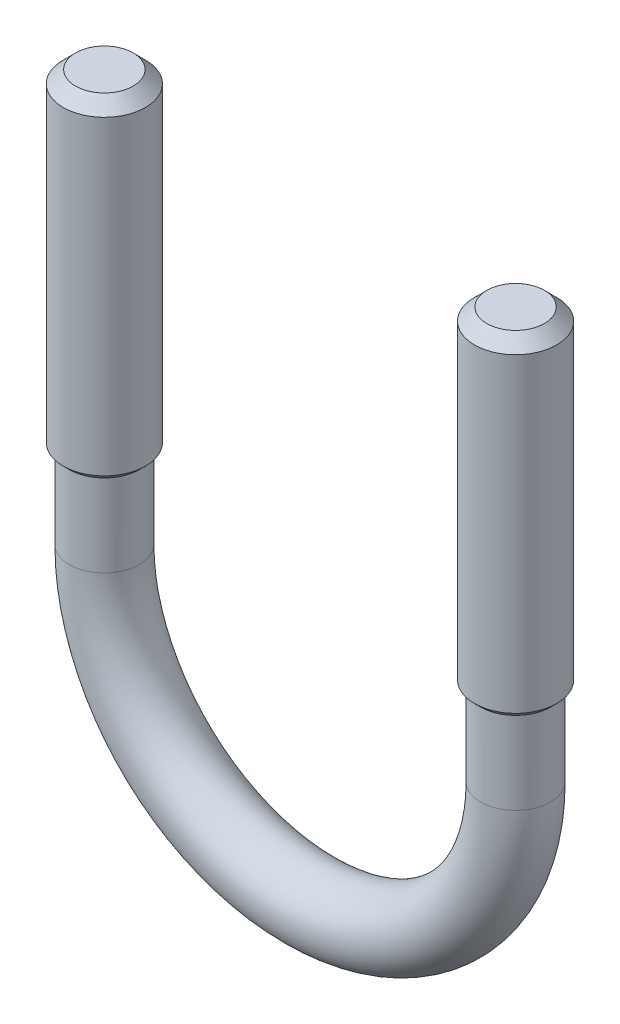
ISO-10303-21;
HEADER;
FILE_DESCRIPTION(('STEP AP214'),'2;1');
FILE_NAME('part.step','',(''),(''),'','','');
FILE_SCHEMA(('AUTOMOTIVE_DESIGN { 1 0 10303 214 1 1 1 1 }'));
ENDSEC;
DATA;
#1=APPLICATION_CONTEXT('core data for automotive mechanical design processes');
#2=APPLICATION_PROTOCOL_DEFINITION('international standard','automotive_design',2000,#1);
#3=PRODUCT_CONTEXT('',#1,'mechanical');
#4=PRODUCT('Part','Part','',(#3));
#5=PRODUCT_RELATED_PRODUCT_CATEGORY('part','',(#4));
#6=PRODUCT_DEFINITION_FORMATION('','',#4);
#7=PRODUCT_DEFINITION_CONTEXT('part definition',#1,'design');
#8=PRODUCT_DEFINITION('design','',#6,#7);
#9=PRODUCT_DEFINITION_SHAPE('','',#8);
#10=(LENGTH_UNIT() NAMED_UNIT(*) SI_UNIT(.MILLI.,.METRE.));
#11=(NAMED_UNIT(*) PLANE_ANGLE_UNIT() SI_UNIT($,.RADIAN.));
#12=(NAMED_UNIT(*) SI_UNIT($,.STERADIAN.) SOLID_ANGLE_UNIT());
#13=UNCERTAINTY_MEASURE_WITH_UNIT(LENGTH_MEASURE(1.E-05),#10,'distance_accuracy_value','');
#14=(GEOMETRIC_REPRESENTATION_CONTEXT(3) GLOBAL_UNCERTAINTY_ASSIGNED_CONTEXT((#13)) GLOBAL_UNIT_ASSIGNED_CONTEXT((#10,
#11,#12)) REPRESENTATION_CONTEXT('',''));
#15=CARTESIAN_POINT('',(0.,0.,0.));
#16=DIRECTION('',(0.,0.,1.));
#17=DIRECTION('',(1.,0.,0.));
#18=AXIS2_PLACEMENT_3D('',#15,#16,#17);
#19=CARTESIAN_POINT('',(-15.875,6.34999999999999,0.));
#20=DIRECTION('',(0.,1.,0.));
#21=DIRECTION('',(0.,0.,1.));
#22=AXIS2_PLACEMENT_3D('',#19,#20,#21);
#23=CYLINDRICAL_SURFACE('',#22,3.17500000000001);
#24=CARTESIAN_POINT('',(-15.875,6.8199,0.));
#25=DIRECTION('',(0.,1.,0.));
#26=DIRECTION('',(0.,0.,1.));
#27=AXIS2_PLACEMENT_3D('',#24,#25,#26);
#28=CIRCLE('',#27,3.17500000000001);
#29=CARTESIAN_POINT('',(-15.875,6.81989999999999,3.175));
#30=VERTEX_POINT('',#29);
#31=EDGE_CURVE('E54',#30,#30,#28,.T.);
#32=ORIENTED_EDGE('',*,*,#31,.T.);
#33=EDGE_LOOP('',(#32));
#34=FACE_BOUND('',#33,.T.);
#35=CARTESIAN_POINT('',(-15.875,30.7975,0.));
#36=DIRECTION('',(0.,1.,0.));
#37=DIRECTION('',(0.,0.,1.));
#38=AXIS2_PLACEMENT_3D('',#35,#36,#37);
#39=CIRCLE('',#38,3.17500000000001);
#40=CARTESIAN_POINT('',(-15.875,30.7975,3.17500000000001));
#41=VERTEX_POINT('',#40);
#42=EDGE_CURVE('E59',#41,#41,#39,.F.);
#43=ORIENTED_EDGE('',*,*,#42,.T.);
#44=EDGE_LOOP('',(#43));
#45=FACE_BOUND('',#44,.T.);
#46=ADVANCED_FACE('F46',(#34,#45),#23,.T.);
#47=CARTESIAN_POINT('',(-15.875,31.75,0.));
#48=DIRECTION('',(0.,1.,0.));
#49=DIRECTION('',(0.,0.,1.));
#50=AXIS2_PLACEMENT_3D('',#47,#48,#49);
#51=PLANE('',#50);
#52=CARTESIAN_POINT('',(-15.875,31.75,0.));
#53=DIRECTION('',(0.,1.,0.));
#54=DIRECTION('',(0.,0.,1.));
#55=AXIS2_PLACEMENT_3D('',#52,#53,#54);
#56=CIRCLE('',#55,2.22250000000001);
#57=CARTESIAN_POINT('',(-15.875,31.75,2.22250000000001));
#58=VERTEX_POINT('',#57);
#59=EDGE_CURVE('E64',#58,#58,#56,.T.);
#60=ORIENTED_EDGE('',*,*,#59,.T.);
#61=EDGE_LOOP('',(#60));
#62=FACE_BOUND('',#61,.T.);
#63=ADVANCED_FACE('F113',(#62),#51,.T.);
#64=CARTESIAN_POINT('',(-15.875,31.75,0.));
#65=DIRECTION('',(0.,-1.,0.));
#66=DIRECTION('',(0.,0.,-1.));
#67=AXIS2_PLACEMENT_3D('',#64,#65,#66);
#68=CONICAL_SURFACE('',#67,2.22250000000001,0.785398163397449);
#69=ORIENTED_EDGE('',*,*,#42,.F.);
#70=EDGE_LOOP('',(#69));
#71=FACE_BOUND('',#70,.T.);
#72=ORIENTED_EDGE('',*,*,#59,.F.);
#73=EDGE_LOOP('',(#72));
#74=FACE_BOUND('',#73,.T.);
#75=ADVANCED_FACE('F120',(#71,#74),#68,.T.);
#76=CARTESIAN_POINT('',(-15.875,6.8199,0.));
#77=DIRECTION('',(0.,1.,0.));
#78=DIRECTION('',(0.,0.,1.));
#79=AXIS2_PLACEMENT_3D('',#76,#77,#78);
#80=CONICAL_SURFACE('',#79,3.17500000000001,0.785398163397451);
#81=CARTESIAN_POINT('',(-15.875,6.34999999999999,0.));
#82=DIRECTION('',(0.,1.,0.));
#83=DIRECTION('',(0.,0.,1.));
#84=AXIS2_PLACEMENT_3D('',#81,#82,#83);
#85=CIRCLE('',#84,2.7051);
#86=CARTESIAN_POINT('',(-15.875,6.34999999999999,2.7051));
#87=VERTEX_POINT('',#86);
#88=EDGE_CURVE('E11',#87,#87,#85,.F.);
#89=CARTESIAN_POINT('',(-15.875,6.34999999999999,2.7051));
#90=CARTESIAN_POINT('',(-15.875,6.35489479166666,2.70999479166667));
#91=CARTESIAN_POINT('',(-15.875,6.35978958333333,2.71488958333333));
#92=CARTESIAN_POINT('',(-15.875,6.36957916666666,2.72467916666667));
#93=CARTESIAN_POINT('',(-15.875,6.37447395833333,2.72957395833333));
#94=CARTESIAN_POINT('',(-15.875,6.38426354166666,2.73936354166667));
#95=CARTESIAN_POINT('',(-15.875,6.38915833333333,2.74425833333333));
#96=CARTESIAN_POINT('',(-15.875,6.39894791666666,2.75404791666667));
#97=CARTESIAN_POINT('',(-15.875,6.40384270833333,2.75894270833333));
#98=CARTESIAN_POINT('',(-15.875,6.41363229166666,2.76873229166667));
#99=CARTESIAN_POINT('',(-15.875,6.41852708333333,2.77362708333334));
#100=CARTESIAN_POINT('',(-15.875,6.42831666666666,2.78341666666667));
#101=CARTESIAN_POINT('',(-15.875,6.43321145833333,2.78831145833334));
#102=CARTESIAN_POINT('',(-15.875,6.44300104166666,2.79810104166667));
#103=CARTESIAN_POINT('',(-15.875,6.44789583333333,2.80299583333334));
#104=CARTESIAN_POINT('',(-15.875,6.45768541666666,2.81278541666667));
#105=CARTESIAN_POINT('',(-15.875,6.46258020833333,2.81768020833334));
#106=CARTESIAN_POINT('',(-15.875,6.47236979166666,2.82746979166667));
#107=CARTESIAN_POINT('',(-15.875,6.47726458333333,2.83236458333334));
#108=CARTESIAN_POINT('',(-15.875,6.48705416666666,2.84215416666667));
#109=CARTESIAN_POINT('',(-15.875,6.49194895833333,2.84704895833334));
#110=CARTESIAN_POINT('',(-15.875,6.50173854166666,2.85683854166667));
#111=CARTESIAN_POINT('',(-15.875,6.50663333333333,2.86173333333334));
#112=CARTESIAN_POINT('',(-15.875,6.51642291666666,2.87152291666667));
#113=CARTESIAN_POINT('',(-15.875,6.52131770833333,2.87641770833334));
#114=CARTESIAN_POINT('',(-15.875,6.53110729166666,2.88620729166667));
#115=CARTESIAN_POINT('',(-15.875,6.53600208333333,2.89110208333334));
#116=CARTESIAN_POINT('',(-15.875,6.54579166666666,2.90089166666667));
#117=CARTESIAN_POINT('',(-15.875,6.55068645833333,2.90578645833334));
#118=CARTESIAN_POINT('',(-15.875,6.56047604166666,2.91557604166667));
#119=CARTESIAN_POINT('',(-15.875,6.56537083333333,2.92047083333334));
#120=CARTESIAN_POINT('',(-15.875,6.57516041666666,2.93026041666667));
#121=CARTESIAN_POINT('',(-15.875,6.58005520833333,2.93515520833334));
#122=CARTESIAN_POINT('',(-15.875,6.58984479166666,2.94494479166667));
#123=CARTESIAN_POINT('',(-15.875,6.59473958333333,2.94983958333334));
#124=CARTESIAN_POINT('',(-15.875,6.60452916666666,2.95962916666667));
#125=CARTESIAN_POINT('',(-15.875,6.60942395833333,2.96452395833334));
#126=CARTESIAN_POINT('',(-15.875,6.61921354166666,2.97431354166667));
#127=CARTESIAN_POINT('',(-15.875,6.62410833333333,2.97920833333334));
#128=CARTESIAN_POINT('',(-15.875,6.63389791666666,2.98899791666667));
#129=CARTESIAN_POINT('',(-15.875,6.63879270833333,2.99389270833334));
#130=CARTESIAN_POINT('',(-15.875,6.64858229166666,3.00368229166667));
#131=CARTESIAN_POINT('',(-15.875,6.65347708333333,3.00857708333334));
#132=CARTESIAN_POINT('',(-15.875,6.66326666666666,3.01836666666667));
#133=CARTESIAN_POINT('',(-15.875,6.66816145833333,3.02326145833334));
#134=CARTESIAN_POINT('',(-15.875,6.67795104166666,3.03305104166667));
#135=CARTESIAN_POINT('',(-15.875,6.68284583333333,3.03794583333334));
#136=CARTESIAN_POINT('',(-15.875,6.69263541666666,3.04773541666667));
#137=CARTESIAN_POINT('',(-15.875,6.69753020833333,3.05263020833334));
#138=CARTESIAN_POINT('',(-15.875,6.70731979166666,3.06241979166667));
#139=CARTESIAN_POINT('',(-15.875,6.71221458333333,3.06731458333334));
#140=CARTESIAN_POINT('',(-15.875,6.72200416666666,3.07710416666667));
#141=CARTESIAN_POINT('',(-15.875,6.72689895833333,3.08199895833334));
#142=CARTESIAN_POINT('',(-15.875,6.73668854166666,3.09178854166667));
#143=CARTESIAN_POINT('',(-15.875,6.74158333333333,3.09668333333334));
#144=CARTESIAN_POINT('',(-15.875,6.75137291666666,3.10647291666667));
#145=CARTESIAN_POINT('',(-15.875,6.75626770833333,3.11136770833334));
#146=CARTESIAN_POINT('',(-15.875,6.76605729166666,3.12115729166667));
#147=CARTESIAN_POINT('',(-15.875,6.77095208333333,3.12605208333334));
#148=CARTESIAN_POINT('',(-15.875,6.78074166666666,3.13584166666667));
#149=CARTESIAN_POINT('',(-15.875,6.78563645833333,3.14073645833334));
#150=CARTESIAN_POINT('',(-15.875,6.79542604166666,3.15052604166667));
#151=CARTESIAN_POINT('',(-15.875,6.80032083333333,3.15542083333334));
#152=CARTESIAN_POINT('',(-15.875,6.81011041666666,3.16521041666667));
#153=CARTESIAN_POINT('',(-15.875,6.81500520833333,3.17010520833334));
#154=CARTESIAN_POINT('',(-15.875,6.8199,3.175));
#155=B_SPLINE_CURVE_WITH_KNOTS('',3,(#89,#90,#91,#92,#93,#94,#95,#96,#97,#98,#99,#100,#101,#102,
#103,#104,#105,#106,#107,#108,#109,#110,#111,#112,#113,#114,#115,#116,#117,#118,#119,#120,#121,
#122,#123,#124,#125,#126,#127,#128,#129,#130,#131,#132,#133,#134,#135,#136,#137,#138,#139,#140,
#141,#142,#143,#144,#145,#146,#147,#148,#149,#150,#151,#152,#153,#154),.UNSPECIFIED.,.F.,.F.,(4,
2,2,2,2,2,2,2,2,2,2,2,2,2,2,2,2,2,2,2,2,2,2,2,2,2,2,2,2,2,2,2,4),(0.,0.0207668422799728,
0.0415336845599453,0.0623005268399176,0.0830673691198901,0.103834211399863,0.124601053679835,
0.145367895959808,0.16613473823978,0.186901580519753,0.207668422799725,0.228435265079698,
0.249202107359671,0.269968949639643,0.290735791919615,0.311502634199587,0.33226947647956,
0.353036318759533,0.373803161039505,0.394570003319478,0.41533684559945,0.436103687879423,
0.456870530159395,0.477637372439368,0.49840421471934,0.519171056999313,0.539937899279285,
0.560704741559258,0.58147158383923,0.602238426119203,0.623005268399175,0.643772110679147,
0.664538952959121),.UNSPECIFIED.);
#156=EDGE_CURVE('BSEAM48',#87,#30,#155,.T.);
#157=ORIENTED_EDGE('',*,*,#88,.F.);
#158=ORIENTED_EDGE('',*,*,#31,.F.);
#159=ORIENTED_EDGE('',*,*,#156,.T.);
#160=ORIENTED_EDGE('',*,*,#156,.F.);
#161=EDGE_LOOP('',(#157,#159,#158,#160));
#162=FACE_BOUND('',#161,.T.);
#163=ADVANCED_FACE('F48',(#162),#80,.T.);
#164=CARTESIAN_POINT('',(15.875,19.05,0.));
#165=DIRECTION('',(0.,-1.,0.));
#166=DIRECTION('',(1.,0.,0.));
#167=AXIS2_PLACEMENT_3D('',#164,#165,#166);
#168=CYLINDRICAL_SURFACE('',#167,2.7051);
#169=CARTESIAN_POINT('',(15.875,6.34999999999999,0.));
#170=DIRECTION('',(0.,-1.,0.));
#171=DIRECTION('',(0.,0.,1.));
#172=AXIS2_PLACEMENT_3D('',#169,#170,#171);
#173=CIRCLE('',#172,2.7051);
#174=CARTESIAN_POINT('',(15.875,6.35,2.7051));
#175=VERTEX_POINT('',#174);
#176=EDGE_CURVE('E78',#175,#175,#173,.F.);
#177=ORIENTED_EDGE('',*,*,#176,.F.);
#178=EDGE_LOOP('',(#177));
#179=FACE_BOUND('',#178,.T.);
#180=CARTESIAN_POINT('',(15.875,0.,0.));
#181=DIRECTION('',(0.,1.,0.));
#182=DIRECTION('',(0.,0.,-1.));
#183=AXIS2_PLACEMENT_3D('',#180,#181,#182);
#184=CIRCLE('',#183,2.7051);
#185=CARTESIAN_POINT('',(18.5801,0.,0.));
#186=VERTEX_POINT('',#185);
#187=EDGE_CURVE('E74',#186,#186,#184,.T.);
#188=ORIENTED_EDGE('',*,*,#187,.T.);
#189=EDGE_LOOP('',(#188));
#190=FACE_BOUND('',#189,.T.);
#191=ADVANCED_FACE('F111',(#179,#190),#168,.T.);
#192=CARTESIAN_POINT('',(0.,0.,0.));
#193=DIRECTION('',(0.,0.,-1.));
#194=DIRECTION('',(-1.,0.,0.));
#195=AXIS2_PLACEMENT_3D('',#192,#193,#194);
#196=TOROIDAL_SURFACE('',#195,15.875,2.7051);
#197=CARTESIAN_POINT('',(-15.875,0.,0.));
#198=DIRECTION('',(0.,-1.,0.));
#199=DIRECTION('',(0.,0.,-1.));
#200=AXIS2_PLACEMENT_3D('',#197,#198,#199);
#201=CIRCLE('',#200,2.7051);
#202=CARTESIAN_POINT('',(-18.5801,0.,0.));
#203=VERTEX_POINT('',#202);
#204=EDGE_CURVE('E70',#203,#203,#201,.T.);
#205=CARTESIAN_POINT('',(0.,0.,0.));
#206=DIRECTION('',(0.,0.,-1.));
#207=DIRECTION('',(-1.,0.,0.));
#208=AXIS2_PLACEMENT_3D('',#205,#206,#207);
#209=CIRCLE('',#208,18.5801);
#210=EDGE_CURVE('',#186,#203,#209,.T.);
#211=ORIENTED_EDGE('',*,*,#187,.F.);
#212=ORIENTED_EDGE('',*,*,#204,.T.);
#213=ORIENTED_EDGE('',*,*,#210,.T.);
#214=ORIENTED_EDGE('',*,*,#210,.F.);
#215=EDGE_LOOP('',(#211,#213,#212,#214));
#216=FACE_BOUND('',#215,.T.);
#217=ADVANCED_FACE('F135',(#216),#196,.T.);
#218=CARTESIAN_POINT('',(-15.875,0.,0.));
#219=DIRECTION('',(0.,1.,0.));
#220=DIRECTION('',(-1.,0.,0.));
#221=AXIS2_PLACEMENT_3D('',#218,#219,#220);
#222=CYLINDRICAL_SURFACE('',#221,2.7051);
#223=ORIENTED_EDGE('',*,*,#88,.T.);
#224=EDGE_LOOP('',(#223));
#225=FACE_BOUND('',#224,.T.);
#226=ORIENTED_EDGE('',*,*,#204,.F.);
#227=EDGE_LOOP('',(#226));
#228=FACE_BOUND('',#227,.T.);
#229=ADVANCED_FACE('F108',(#225,#228),#222,.T.);
#230=CARTESIAN_POINT('',(15.875,6.34999999999999,0.));
#231=DIRECTION('',(0.,1.,0.));
#232=DIRECTION('',(0.,0.,1.));
#233=AXIS2_PLACEMENT_3D('',#230,#231,#232);
#234=CYLINDRICAL_SURFACE('',#233,3.17500000000001);
#235=CARTESIAN_POINT('',(15.875,6.8199,0.));
#236=DIRECTION('',(0.,-1.,0.));
#237=DIRECTION('',(0.,0.,1.));
#238=AXIS2_PLACEMENT_3D('',#235,#236,#237);
#239=CIRCLE('',#238,3.17500000000001);
#240=CARTESIAN_POINT('',(15.875,6.8199,3.17500000000001));
#241=VERTEX_POINT('',#240);
#242=EDGE_CURVE('E82',#241,#241,#239,.T.);
#243=ORIENTED_EDGE('',*,*,#242,.F.);
#244=EDGE_LOOP('',(#243));
#245=FACE_BOUND('',#244,.T.);
#246=CARTESIAN_POINT('',(15.875,30.7975,0.));
#247=DIRECTION('',(0.,-1.,0.));
#248=DIRECTION('',(0.,0.,1.));
#249=AXIS2_PLACEMENT_3D('',#246,#247,#248);
#250=CIRCLE('',#249,3.17500000000001);
#251=CARTESIAN_POINT('',(15.875,30.7975,3.17500000000001));
#252=VERTEX_POINT('',#251);
#253=EDGE_CURVE('E86',#252,#252,#250,.F.);
#254=ORIENTED_EDGE('',*,*,#253,.F.);
#255=EDGE_LOOP('',(#254));
#256=FACE_BOUND('',#255,.T.);
#257=ADVANCED_FACE('F99',(#245,#256),#234,.T.);
#258=CARTESIAN_POINT('',(15.875,31.75,0.));
#259=DIRECTION('',(0.,1.,0.));
#260=DIRECTION('',(0.,0.,1.));
#261=AXIS2_PLACEMENT_3D('',#258,#259,#260);
#262=PLANE('',#261);
#263=CARTESIAN_POINT('',(15.875,31.75,0.));
#264=DIRECTION('',(0.,-1.,0.));
#265=DIRECTION('',(0.,0.,1.));
#266=AXIS2_PLACEMENT_3D('',#263,#264,#265);
#267=CIRCLE('',#266,2.22250000000001);
#268=CARTESIAN_POINT('',(15.875,31.75,2.22250000000001));
#269=VERTEX_POINT('',#268);
#270=EDGE_CURVE('E90',#269,#269,#267,.T.);
#271=ORIENTED_EDGE('',*,*,#270,.F.);
#272=EDGE_LOOP('',(#271));
#273=FACE_BOUND('',#272,.T.);
#274=ADVANCED_FACE('F97',(#273),#262,.T.);
#275=CARTESIAN_POINT('',(15.875,31.75,0.));
#276=DIRECTION('',(0.,-1.,0.));
#277=DIRECTION('',(0.,0.,-1.));
#278=AXIS2_PLACEMENT_3D('',#275,#276,#277);
#279=CONICAL_SURFACE('',#278,2.22250000000001,0.785398163397449);
#280=ORIENTED_EDGE('',*,*,#253,.T.);
#281=EDGE_LOOP('',(#280));
#282=FACE_BOUND('',#281,.T.);
#283=ORIENTED_EDGE('',*,*,#270,.T.);
#284=EDGE_LOOP('',(#283));
#285=FACE_BOUND('',#284,.T.);
#286=ADVANCED_FACE('F95',(#282,#285),#279,.T.);
#287=CARTESIAN_POINT('',(15.875,6.8199,0.));
#288=DIRECTION('',(0.,1.,0.));
#289=DIRECTION('',(0.,0.,1.));
#290=AXIS2_PLACEMENT_3D('',#287,#288,#289);
#291=CONICAL_SURFACE('',#290,3.17500000000001,0.785398163397451);
#292=CARTESIAN_POINT('',(15.875,6.35,2.7051));
#293=CARTESIAN_POINT('',(15.875,6.35489479166666,2.70999479166667));
#294=CARTESIAN_POINT('',(15.875,6.35978958333333,2.71488958333334));
#295=CARTESIAN_POINT('',(15.875,6.36957916666666,2.72467916666667));
#296=CARTESIAN_POINT('',(15.875,6.37447395833333,2.72957395833334));
#297=CARTESIAN_POINT('',(15.875,6.38426354166666,2.73936354166667));
#298=CARTESIAN_POINT('',(15.875,6.38915833333333,2.74425833333334));
#299=CARTESIAN_POINT('',(15.875,6.39894791666666,2.75404791666667));
#300=CARTESIAN_POINT('',(15.875,6.40384270833333,2.75894270833334));
#301=CARTESIAN_POINT('',(15.875,6.41363229166666,2.76873229166667));
#302=CARTESIAN_POINT('',(15.875,6.41852708333333,2.77362708333334));
#303=CARTESIAN_POINT('',(15.875,6.42831666666666,2.78341666666667));
#304=CARTESIAN_POINT('',(15.875,6.43321145833333,2.78831145833334));
#305=CARTESIAN_POINT('',(15.875,6.44300104166666,2.79810104166667));
#306=CARTESIAN_POINT('',(15.875,6.44789583333333,2.80299583333334));
#307=CARTESIAN_POINT('',(15.875,6.45768541666666,2.81278541666667));
#308=CARTESIAN_POINT('',(15.875,6.46258020833333,2.81768020833334));
#309=CARTESIAN_POINT('',(15.875,6.47236979166666,2.82746979166667));
#310=CARTESIAN_POINT('',(15.875,6.47726458333333,2.83236458333334));
#311=CARTESIAN_POINT('',(15.875,6.48705416666666,2.84215416666667));
#312=CARTESIAN_POINT('',(15.875,6.49194895833333,2.84704895833334));
#313=CARTESIAN_POINT('',(15.875,6.50173854166666,2.85683854166667));
#314=CARTESIAN_POINT('',(15.875,6.50663333333333,2.86173333333334));
#315=CARTESIAN_POINT('',(15.875,6.51642291666666,2.87152291666667));
#316=CARTESIAN_POINT('',(15.875,6.52131770833333,2.87641770833334));
#317=CARTESIAN_POINT('',(15.875,6.53110729166666,2.88620729166667));
#318=CARTESIAN_POINT('',(15.875,6.53600208333333,2.89110208333334));
#319=CARTESIAN_POINT('',(15.875,6.54579166666666,2.90089166666667));
#320=CARTESIAN_POINT('',(15.875,6.55068645833333,2.90578645833334));
#321=CARTESIAN_POINT('',(15.875,6.56047604166666,2.91557604166667));
#322=CARTESIAN_POINT('',(15.875,6.56537083333333,2.92047083333334));
#323=CARTESIAN_POINT('',(15.875,6.57516041666666,2.93026041666667));
#324=CARTESIAN_POINT('',(15.875,6.58005520833333,2.93515520833334));
#325=CARTESIAN_POINT('',(15.875,6.58984479166666,2.94494479166667));
#326=CARTESIAN_POINT('',(15.875,6.59473958333333,2.94983958333334));
#327=CARTESIAN_POINT('',(15.875,6.60452916666666,2.95962916666667));
#328=CARTESIAN_POINT('',(15.875,6.60942395833333,2.96452395833334));
#329=CARTESIAN_POINT('',(15.875,6.61921354166666,2.97431354166667));
#330=CARTESIAN_POINT('',(15.875,6.62410833333333,2.97920833333334));
#331=CARTESIAN_POINT('',(15.875,6.63389791666666,2.98899791666667));
#332=CARTESIAN_POINT('',(15.875,6.63879270833333,2.99389270833334));
#333=CARTESIAN_POINT('',(15.875,6.64858229166666,3.00368229166667));
#334=CARTESIAN_POINT('',(15.875,6.65347708333333,3.00857708333334));
#335=CARTESIAN_POINT('',(15.875,6.66326666666666,3.01836666666667));
#336=CARTESIAN_POINT('',(15.875,6.66816145833333,3.02326145833334));
#337=CARTESIAN_POINT('',(15.875,6.67795104166666,3.03305104166667));
#338=CARTESIAN_POINT('',(15.875,6.68284583333333,3.03794583333334));
#339=CARTESIAN_POINT('',(15.875,6.69263541666666,3.04773541666667));
#340=CARTESIAN_POINT('',(15.875,6.69753020833333,3.05263020833334));
#341=CARTESIAN_POINT('',(15.875,6.70731979166666,3.06241979166667));
#342=CARTESIAN_POINT('',(15.875,6.71221458333333,3.06731458333334));
#343=CARTESIAN_POINT('',(15.875,6.72200416666666,3.07710416666667));
#344=CARTESIAN_POINT('',(15.875,6.72689895833333,3.08199895833334));
#345=CARTESIAN_POINT('',(15.875,6.73668854166666,3.09178854166667));
#346=CARTESIAN_POINT('',(15.875,6.74158333333333,3.09668333333334));
#347=CARTESIAN_POINT('',(15.875,6.75137291666666,3.10647291666667));
#348=CARTESIAN_POINT('',(15.875,6.75626770833333,3.11136770833334));
#349=CARTESIAN_POINT('',(15.875,6.76605729166666,3.12115729166667));
#350=CARTESIAN_POINT('',(15.875,6.77095208333333,3.12605208333334));
#351=CARTESIAN_POINT('',(15.875,6.78074166666666,3.13584166666667));
#352=CARTESIAN_POINT('',(15.875,6.78563645833333,3.14073645833334));
#353=CARTESIAN_POINT('',(15.875,6.79542604166666,3.15052604166667));
#354=CARTESIAN_POINT('',(15.875,6.80032083333333,3.15542083333334));
#355=CARTESIAN_POINT('',(15.875,6.81011041666666,3.16521041666667));
#356=CARTESIAN_POINT('',(15.875,6.81500520833333,3.17010520833334));
#357=CARTESIAN_POINT('',(15.875,6.8199,3.17500000000001));
#358=B_SPLINE_CURVE_WITH_KNOTS('',3,(#292,#293,#294,#295,#296,#297,#298,#299,#300,#301,#302,
#303,#304,#305,#306,#307,#308,#309,#310,#311,#312,#313,#314,#315,#316,#317,#318,#319,#320,#321,
#322,#323,#324,#325,#326,#327,#328,#329,#330,#331,#332,#333,#334,#335,#336,#337,#338,#339,#340,
#341,#342,#343,#344,#345,#346,#347,#348,#349,#350,#351,#352,#353,#354,#355,#356,#357),
.UNSPECIFIED.,.F.,.F.,(4,2,2,2,2,2,2,2,2,2,2,2,2,2,2,2,2,2,2,2,2,2,2,2,2,2,2,2,2,2,2,2,4),(0.,
0.0207668422799725,0.0415336845599447,0.0623005268399172,0.0830673691198894,0.103834211399862,
0.124601053679835,0.145367895959807,0.16613473823978,0.186901580519752,0.207668422799725,
0.228435265079697,0.24920210735967,0.269968949639642,0.290735791919615,0.311502634199587,
0.33226947647956,0.353036318759532,0.373803161039505,0.394570003319477,0.415336845599449,
0.436103687879422,0.456870530159395,0.477637372439367,0.498404214719339,0.519171056999312,
0.539937899279284,0.560704741559257,0.58147158383923,0.602238426119202,0.623005268399175,
0.643772110679147,0.664538952959119),.UNSPECIFIED.);
#359=EDGE_CURVE('BSEAM105',#175,#241,#358,.T.);
#360=ORIENTED_EDGE('',*,*,#176,.T.);
#361=ORIENTED_EDGE('',*,*,#242,.T.);
#362=ORIENTED_EDGE('',*,*,#359,.T.);
#363=ORIENTED_EDGE('',*,*,#359,.F.);
#364=EDGE_LOOP('',(#360,#362,#361,#363));
#365=FACE_BOUND('',#364,.T.);
#366=ADVANCED_FACE('F105',(#365),#291,.T.);
#367=CLOSED_SHELL('',(#46,#63,#75,#163,#191,#217,#229,#257,#274,#286,#366));
#368=MANIFOLD_SOLID_BREP('B2',#367);
#369=ADVANCED_BREP_SHAPE_REPRESENTATION('',(#18,#368),#14);
#370=SHAPE_DEFINITION_REPRESENTATION(#9,#369);
ENDSEC;
END-ISO-10303-21;
